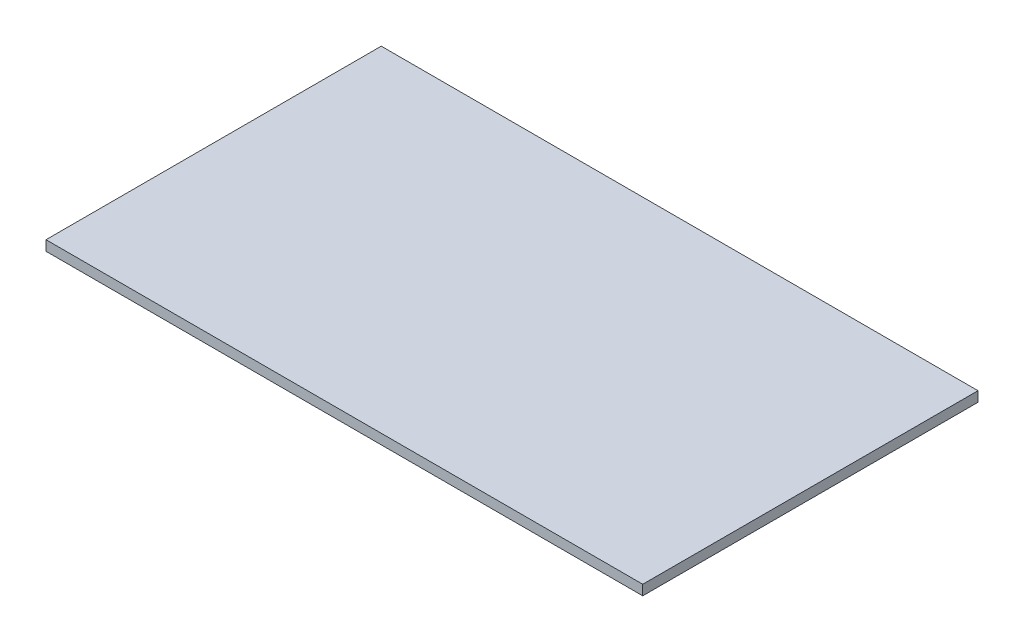
ISO-10303-21;
HEADER;
FILE_DESCRIPTION(('STEP AP214'),'2;1');
FILE_NAME('part.step','',(''),(''),'','','');
FILE_SCHEMA(('AUTOMOTIVE_DESIGN { 1 0 10303 214 1 1 1 1 }'));
ENDSEC;
DATA;
#1=APPLICATION_CONTEXT('core data for automotive mechanical design processes');
#2=APPLICATION_PROTOCOL_DEFINITION('international standard','automotive_design',2000,#1);
#3=PRODUCT_CONTEXT('',#1,'mechanical');
#4=PRODUCT('Part','Part','',(#3));
#5=PRODUCT_RELATED_PRODUCT_CATEGORY('part','',(#4));
#6=PRODUCT_DEFINITION_FORMATION('','',#4);
#7=PRODUCT_DEFINITION_CONTEXT('part definition',#1,'design');
#8=PRODUCT_DEFINITION('design','',#6,#7);
#9=PRODUCT_DEFINITION_SHAPE('','',#8);
#10=(LENGTH_UNIT() NAMED_UNIT(*) SI_UNIT(.MILLI.,.METRE.));
#11=(NAMED_UNIT(*) PLANE_ANGLE_UNIT() SI_UNIT($,.RADIAN.));
#12=(NAMED_UNIT(*) SI_UNIT($,.STERADIAN.) SOLID_ANGLE_UNIT());
#13=UNCERTAINTY_MEASURE_WITH_UNIT(LENGTH_MEASURE(1.E-05),#10,'distance_accuracy_value','');
#14=(GEOMETRIC_REPRESENTATION_CONTEXT(3) GLOBAL_UNCERTAINTY_ASSIGNED_CONTEXT((#13)) GLOBAL_UNIT_ASSIGNED_CONTEXT((#10,
#11,#12)) REPRESENTATION_CONTEXT('',''));
#15=CARTESIAN_POINT('',(0.,0.,0.));
#16=DIRECTION('',(0.,0.,1.));
#17=DIRECTION('',(1.,0.,0.));
#18=AXIS2_PLACEMENT_3D('',#15,#16,#17);
#19=CARTESIAN_POINT('',(0.,15.,0.));
#20=DIRECTION('',(1.,0.,0.));
#21=DIRECTION('',(0.,0.,-1.));
#22=AXIS2_PLACEMENT_3D('',#19,#20,#21);
#23=PLANE('',#22);
#24=DIRECTION('',(0.,0.,1.));
#25=VECTOR('',#24,1.);
#26=CARTESIAN_POINT('',(0.,0.,0.));
#27=LINE('',#26,#25);
#28=CARTESIAN_POINT('',(0.,0.,-500.));
#29=VERTEX_POINT('',#28);
#30=CARTESIAN_POINT('',(0.,0.,0.));
#31=VERTEX_POINT('',#30);
#32=EDGE_CURVE('E103',#29,#31,#27,.T.);
#33=ORIENTED_EDGE('',*,*,#32,.T.);
#34=DIRECTION('',(0.,-1.,0.));
#35=VECTOR('',#34,1.);
#36=CARTESIAN_POINT('',(0.,15.,0.));
#37=LINE('',#36,#35);
#38=CARTESIAN_POINT('',(0.,15.,0.));
#39=VERTEX_POINT('',#38);
#40=EDGE_CURVE('E11',#39,#31,#37,.T.);
#41=ORIENTED_EDGE('',*,*,#40,.F.);
#42=DIRECTION('',(0.,0.,1.));
#43=VECTOR('',#42,1.);
#44=CARTESIAN_POINT('',(0.,15.,0.));
#45=LINE('',#44,#43);
#46=CARTESIAN_POINT('',(0.,15.,-500.));
#47=VERTEX_POINT('',#46);
#48=EDGE_CURVE('E90',#47,#39,#45,.T.);
#49=ORIENTED_EDGE('',*,*,#48,.F.);
#50=DIRECTION('',(0.,-1.,0.));
#51=VECTOR('',#50,1.);
#52=CARTESIAN_POINT('',(0.,15.,-500.));
#53=LINE('',#52,#51);
#54=EDGE_CURVE('E99',#47,#29,#53,.T.);
#55=ORIENTED_EDGE('',*,*,#54,.T.);
#56=EDGE_LOOP('',(#33,#41,#49,#55));
#57=FACE_BOUND('',#56,.T.);
#58=ADVANCED_FACE('F37',(#57),#23,.F.);
#59=CARTESIAN_POINT('',(0.,15.,0.));
#60=DIRECTION('',(0.,0.,-1.));
#61=DIRECTION('',(-1.,0.,0.));
#62=AXIS2_PLACEMENT_3D('',#59,#60,#61);
#63=PLANE('',#62);
#64=DIRECTION('',(1.,0.,0.));
#65=VECTOR('',#64,1.);
#66=CARTESIAN_POINT('',(0.,0.,0.));
#67=LINE('',#66,#65);
#68=CARTESIAN_POINT('',(890.,0.,0.));
#69=VERTEX_POINT('',#68);
#70=EDGE_CURVE('E94',#31,#69,#67,.T.);
#71=ORIENTED_EDGE('',*,*,#70,.T.);
#72=DIRECTION('',(0.,-1.,0.));
#73=VECTOR('',#72,1.);
#74=CARTESIAN_POINT('',(890.,15.,0.));
#75=LINE('',#74,#73);
#76=CARTESIAN_POINT('',(890.,15.,0.));
#77=VERTEX_POINT('',#76);
#78=EDGE_CURVE('E45',#77,#69,#75,.T.);
#79=ORIENTED_EDGE('',*,*,#78,.F.);
#80=DIRECTION('',(1.,0.,0.));
#81=VECTOR('',#80,1.);
#82=CARTESIAN_POINT('',(0.,15.,0.));
#83=LINE('',#82,#81);
#84=EDGE_CURVE('E85',#39,#77,#83,.T.);
#85=ORIENTED_EDGE('',*,*,#84,.F.);
#86=ORIENTED_EDGE('',*,*,#40,.T.);
#87=EDGE_LOOP('',(#71,#79,#85,#86));
#88=FACE_BOUND('',#87,.T.);
#89=ADVANCED_FACE('F93',(#88),#63,.F.);
#90=CARTESIAN_POINT('',(890.,15.,0.));
#91=DIRECTION('',(-1.,0.,0.));
#92=DIRECTION('',(0.,0.,1.));
#93=AXIS2_PLACEMENT_3D('',#90,#91,#92);
#94=PLANE('',#93);
#95=DIRECTION('',(0.,0.,-1.));
#96=VECTOR('',#95,1.);
#97=CARTESIAN_POINT('',(890.,0.,0.));
#98=LINE('',#97,#96);
#99=CARTESIAN_POINT('',(890.,0.,-500.));
#100=VERTEX_POINT('',#99);
#101=EDGE_CURVE('E72',#69,#100,#98,.T.);
#102=ORIENTED_EDGE('',*,*,#101,.T.);
#103=DIRECTION('',(0.,-1.,0.));
#104=VECTOR('',#103,1.);
#105=CARTESIAN_POINT('',(890.,15.,-500.));
#106=LINE('',#105,#104);
#107=CARTESIAN_POINT('',(890.,15.,-500.));
#108=VERTEX_POINT('',#107);
#109=EDGE_CURVE('E95',#108,#100,#106,.T.);
#110=ORIENTED_EDGE('',*,*,#109,.F.);
#111=DIRECTION('',(0.,0.,-1.));
#112=VECTOR('',#111,1.);
#113=CARTESIAN_POINT('',(890.,15.,0.));
#114=LINE('',#113,#112);
#115=EDGE_CURVE('E88',#77,#108,#114,.T.);
#116=ORIENTED_EDGE('',*,*,#115,.F.);
#117=ORIENTED_EDGE('',*,*,#78,.T.);
#118=EDGE_LOOP('',(#102,#110,#116,#117));
#119=FACE_BOUND('',#118,.T.);
#120=ADVANCED_FACE('F96',(#119),#94,.F.);
#121=CARTESIAN_POINT('',(0.,15.,-500.));
#122=DIRECTION('',(0.,0.,1.));
#123=DIRECTION('',(1.,0.,0.));
#124=AXIS2_PLACEMENT_3D('',#121,#122,#123);
#125=PLANE('',#124);
#126=DIRECTION('',(-1.,0.,0.));
#127=VECTOR('',#126,1.);
#128=CARTESIAN_POINT('',(0.,0.,-500.));
#129=LINE('',#128,#127);
#130=EDGE_CURVE('E78',#100,#29,#129,.T.);
#131=ORIENTED_EDGE('',*,*,#130,.T.);
#132=ORIENTED_EDGE('',*,*,#54,.F.);
#133=DIRECTION('',(-1.,0.,0.));
#134=VECTOR('',#133,1.);
#135=CARTESIAN_POINT('',(0.,15.,-500.));
#136=LINE('',#135,#134);
#137=EDGE_CURVE('E55',#108,#47,#136,.T.);
#138=ORIENTED_EDGE('',*,*,#137,.F.);
#139=ORIENTED_EDGE('',*,*,#109,.T.);
#140=EDGE_LOOP('',(#131,#132,#138,#139));
#141=FACE_BOUND('',#140,.T.);
#142=ADVANCED_FACE('F113',(#141),#125,.F.);
#143=CARTESIAN_POINT('',(0.,15.,0.));
#144=DIRECTION('',(0.,-1.,0.));
#145=DIRECTION('',(0.,0.,-1.));
#146=AXIS2_PLACEMENT_3D('',#143,#144,#145);
#147=PLANE('',#146);
#148=ORIENTED_EDGE('',*,*,#48,.T.);
#149=ORIENTED_EDGE('',*,*,#84,.T.);
#150=ORIENTED_EDGE('',*,*,#115,.T.);
#151=ORIENTED_EDGE('',*,*,#137,.T.);
#152=EDGE_LOOP('',(#148,#149,#150,#151));
#153=FACE_BOUND('',#152,.T.);
#154=ADVANCED_FACE('F86',(#153),#147,.F.);
#155=CARTESIAN_POINT('',(0.,0.,0.));
#156=DIRECTION('',(0.,-1.,0.));
#157=DIRECTION('',(0.,0.,-1.));
#158=AXIS2_PLACEMENT_3D('',#155,#156,#157);
#159=PLANE('',#158);
#160=ORIENTED_EDGE('',*,*,#32,.F.);
#161=ORIENTED_EDGE('',*,*,#130,.F.);
#162=ORIENTED_EDGE('',*,*,#101,.F.);
#163=ORIENTED_EDGE('',*,*,#70,.F.);
#164=EDGE_LOOP('',(#160,#161,#162,#163));
#165=FACE_BOUND('',#164,.T.);
#166=ADVANCED_FACE('F116',(#165),#159,.T.);
#167=CLOSED_SHELL('',(#58,#89,#120,#142,#154,#166));
#168=MANIFOLD_SOLID_BREP('B2',#167);
#169=ADVANCED_BREP_SHAPE_REPRESENTATION('',(#18,#168),#14);
#170=SHAPE_DEFINITION_REPRESENTATION(#9,#169);
ENDSEC;
END-ISO-10303-21;
